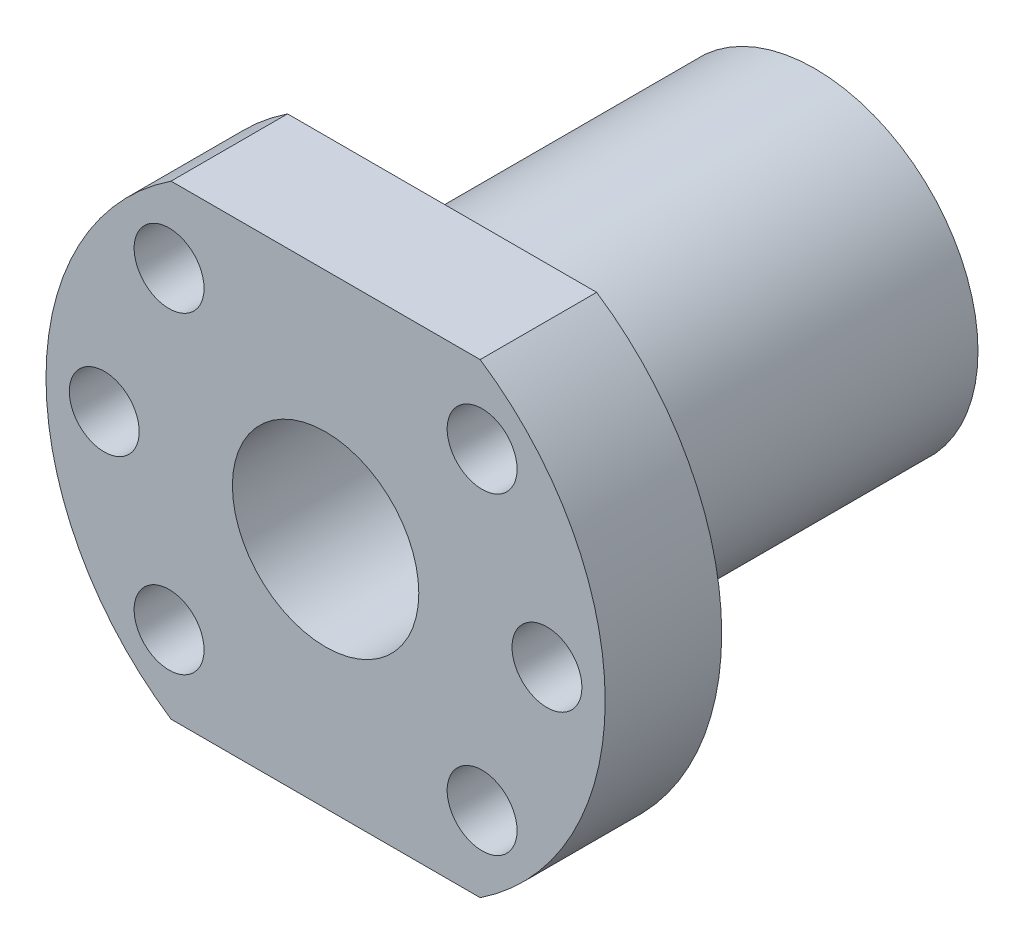
ISO-10303-21;
HEADER;
FILE_DESCRIPTION(('STEP AP214'),'2;1');
FILE_NAME('part.step','',(''),(''),'','','');
FILE_SCHEMA(('AUTOMOTIVE_DESIGN { 1 0 10303 214 1 1 1 1 }'));
ENDSEC;
DATA;
#1=APPLICATION_CONTEXT('core data for automotive mechanical design processes');
#2=APPLICATION_PROTOCOL_DEFINITION('international standard','automotive_design',2000,#1);
#3=PRODUCT_CONTEXT('',#1,'mechanical');
#4=PRODUCT('Part','Part','',(#3));
#5=PRODUCT_RELATED_PRODUCT_CATEGORY('part','',(#4));
#6=PRODUCT_DEFINITION_FORMATION('','',#4);
#7=PRODUCT_DEFINITION_CONTEXT('part definition',#1,'design');
#8=PRODUCT_DEFINITION('design','',#6,#7);
#9=PRODUCT_DEFINITION_SHAPE('','',#8);
#10=(LENGTH_UNIT() NAMED_UNIT(*) SI_UNIT(.MILLI.,.METRE.));
#11=(NAMED_UNIT(*) PLANE_ANGLE_UNIT() SI_UNIT($,.RADIAN.));
#12=(NAMED_UNIT(*) SI_UNIT($,.STERADIAN.) SOLID_ANGLE_UNIT());
#13=UNCERTAINTY_MEASURE_WITH_UNIT(LENGTH_MEASURE(1.E-05),#10,'distance_accuracy_value','');
#14=(GEOMETRIC_REPRESENTATION_CONTEXT(3) GLOBAL_UNCERTAINTY_ASSIGNED_CONTEXT((#13)) GLOBAL_UNIT_ASSIGNED_CONTEXT((#10,
#11,#12)) REPRESENTATION_CONTEXT('',''));
#15=CARTESIAN_POINT('',(0.,0.,0.));
#16=DIRECTION('',(0.,0.,1.));
#17=DIRECTION('',(1.,0.,0.));
#18=AXIS2_PLACEMENT_3D('',#15,#16,#17);
#19=CARTESIAN_POINT('',(0.,20.,10.));
#20=DIRECTION('',(0.,1.,0.));
#21=DIRECTION('',(0.,0.,1.));
#22=AXIS2_PLACEMENT_3D('',#19,#20,#21);
#23=PLANE('',#22);
#24=DIRECTION('',(1.,0.,0.));
#25=VECTOR('',#24,1.);
#26=CARTESIAN_POINT('',(0.,20.,0.));
#27=LINE('',#26,#25);
#28=CARTESIAN_POINT('',(-13.2664991614216,20.,0.));
#29=VERTEX_POINT('',#28);
#30=CARTESIAN_POINT('',(13.2664991614216,20.,0.));
#31=VERTEX_POINT('',#30);
#32=EDGE_CURVE('E108',#29,#31,#27,.T.);
#33=ORIENTED_EDGE('',*,*,#32,.F.);
#34=DIRECTION('',(0.,0.,-1.));
#35=VECTOR('',#34,1.);
#36=CARTESIAN_POINT('',(-13.2664991614216,20.,10.));
#37=LINE('',#36,#35);
#38=CARTESIAN_POINT('',(-13.2664991614216,20.,10.));
#39=VERTEX_POINT('',#38);
#40=EDGE_CURVE('E11',#39,#29,#37,.T.);
#41=ORIENTED_EDGE('',*,*,#40,.F.);
#42=DIRECTION('',(1.,0.,0.));
#43=VECTOR('',#42,1.);
#44=CARTESIAN_POINT('',(0.,20.,10.));
#45=LINE('',#44,#43);
#46=CARTESIAN_POINT('',(13.2664991614216,20.,10.));
#47=VERTEX_POINT('',#46);
#48=EDGE_CURVE('E93',#39,#47,#45,.T.);
#49=ORIENTED_EDGE('',*,*,#48,.T.);
#50=DIRECTION('',(0.,0.,-1.));
#51=VECTOR('',#50,1.);
#52=CARTESIAN_POINT('',(13.2664991614216,20.,10.));
#53=LINE('',#52,#51);
#54=EDGE_CURVE('E74',#47,#31,#53,.T.);
#55=ORIENTED_EDGE('',*,*,#54,.T.);
#56=EDGE_LOOP('',(#33,#41,#49,#55));
#57=FACE_BOUND('',#56,.T.);
#58=ADVANCED_FACE('F35',(#57),#23,.T.);
#59=CARTESIAN_POINT('',(0.,0.,10.));
#60=DIRECTION('',(0.,0.,-1.));
#61=DIRECTION('',(-1.,0.,0.));
#62=AXIS2_PLACEMENT_3D('',#59,#60,#61);
#63=CYLINDRICAL_SURFACE('',#62,24.);
#64=CARTESIAN_POINT('',(0.,0.,0.));
#65=DIRECTION('',(0.,0.,1.));
#66=DIRECTION('',(1.,0.,0.));
#67=AXIS2_PLACEMENT_3D('',#64,#65,#66);
#68=CIRCLE('',#67,24.);
#69=CARTESIAN_POINT('',(-13.2664991614216,-20.,0.));
#70=VERTEX_POINT('',#69);
#71=EDGE_CURVE('E98',#29,#70,#68,.T.);
#72=ORIENTED_EDGE('',*,*,#71,.T.);
#73=DIRECTION('',(0.,0.,-1.));
#74=VECTOR('',#73,1.);
#75=CARTESIAN_POINT('',(-13.2664991614216,-20.,10.));
#76=LINE('',#75,#74);
#77=CARTESIAN_POINT('',(-13.2664991614216,-20.,10.));
#78=VERTEX_POINT('',#77);
#79=EDGE_CURVE('E44',#78,#70,#76,.T.);
#80=ORIENTED_EDGE('',*,*,#79,.F.);
#81=CARTESIAN_POINT('',(0.,0.,10.));
#82=DIRECTION('',(0.,0.,1.));
#83=DIRECTION('',(1.,0.,0.));
#84=AXIS2_PLACEMENT_3D('',#81,#82,#83);
#85=CIRCLE('',#84,24.);
#86=EDGE_CURVE('E89',#39,#78,#85,.T.);
#87=ORIENTED_EDGE('',*,*,#86,.F.);
#88=ORIENTED_EDGE('',*,*,#40,.T.);
#89=EDGE_LOOP('',(#72,#80,#87,#88));
#90=FACE_BOUND('',#89,.T.);
#91=ADVANCED_FACE('F96',(#90),#63,.T.);
#92=CARTESIAN_POINT('',(0.,-20.,10.));
#93=DIRECTION('',(0.,1.,0.));
#94=DIRECTION('',(0.,0.,1.));
#95=AXIS2_PLACEMENT_3D('',#92,#93,#94);
#96=PLANE('',#95);
#97=DIRECTION('',(1.,0.,0.));
#98=VECTOR('',#97,1.);
#99=CARTESIAN_POINT('',(0.,-20.,0.));
#100=LINE('',#99,#98);
#101=CARTESIAN_POINT('',(13.2664991614216,-20.,0.));
#102=VERTEX_POINT('',#101);
#103=EDGE_CURVE('E105',#70,#102,#100,.T.);
#104=ORIENTED_EDGE('',*,*,#103,.T.);
#105=DIRECTION('',(0.,0.,-1.));
#106=VECTOR('',#105,1.);
#107=CARTESIAN_POINT('',(13.2664991614216,-20.,10.));
#108=LINE('',#107,#106);
#109=CARTESIAN_POINT('',(13.2664991614216,-20.,10.));
#110=VERTEX_POINT('',#109);
#111=EDGE_CURVE('E88',#110,#102,#108,.T.);
#112=ORIENTED_EDGE('',*,*,#111,.F.);
#113=DIRECTION('',(1.,0.,0.));
#114=VECTOR('',#113,1.);
#115=CARTESIAN_POINT('',(0.,-20.,10.));
#116=LINE('',#115,#114);
#117=EDGE_CURVE('E82',#78,#110,#116,.T.);
#118=ORIENTED_EDGE('',*,*,#117,.F.);
#119=ORIENTED_EDGE('',*,*,#79,.T.);
#120=EDGE_LOOP('',(#104,#112,#118,#119));
#121=FACE_BOUND('',#120,.T.);
#122=ADVANCED_FACE('F85',(#121),#96,.F.);
#123=CARTESIAN_POINT('',(0.,0.,10.));
#124=DIRECTION('',(0.,0.,-1.));
#125=DIRECTION('',(-1.,0.,0.));
#126=AXIS2_PLACEMENT_3D('',#123,#124,#125);
#127=CYLINDRICAL_SURFACE('',#126,24.);
#128=CARTESIAN_POINT('',(0.,0.,0.));
#129=DIRECTION('',(0.,0.,1.));
#130=DIRECTION('',(1.,0.,0.));
#131=AXIS2_PLACEMENT_3D('',#128,#129,#130);
#132=CIRCLE('',#131,24.);
#133=EDGE_CURVE('E67',#102,#31,#132,.T.);
#134=ORIENTED_EDGE('',*,*,#133,.T.);
#135=ORIENTED_EDGE('',*,*,#54,.F.);
#136=CARTESIAN_POINT('',(0.,0.,10.));
#137=DIRECTION('',(0.,0.,1.));
#138=DIRECTION('',(1.,0.,0.));
#139=AXIS2_PLACEMENT_3D('',#136,#137,#138);
#140=CIRCLE('',#139,24.);
#141=EDGE_CURVE('E52',#110,#47,#140,.T.);
#142=ORIENTED_EDGE('',*,*,#141,.F.);
#143=ORIENTED_EDGE('',*,*,#111,.T.);
#144=EDGE_LOOP('',(#134,#135,#142,#143));
#145=FACE_BOUND('',#144,.T.);
#146=ADVANCED_FACE('F189',(#145),#127,.T.);
#147=CARTESIAN_POINT('',(19.,0.,10.));
#148=DIRECTION('',(0.,0.,-1.));
#149=DIRECTION('',(-1.,0.,0.));
#150=AXIS2_PLACEMENT_3D('',#147,#148,#149);
#151=CYLINDRICAL_SURFACE('',#150,3.);
#152=CARTESIAN_POINT('',(19.,0.,10.));
#153=DIRECTION('',(0.,0.,1.));
#154=DIRECTION('',(1.,0.,0.));
#155=AXIS2_PLACEMENT_3D('',#152,#153,#154);
#156=CIRCLE('',#155,3.);
#157=CARTESIAN_POINT('',(22.,0.,10.));
#158=VERTEX_POINT('',#157);
#159=EDGE_CURVE('E133',#158,#158,#156,.T.);
#160=ORIENTED_EDGE('',*,*,#159,.T.);
#161=EDGE_LOOP('',(#160));
#162=FACE_BOUND('',#161,.T.);
#163=CARTESIAN_POINT('',(19.,0.,0.));
#164=DIRECTION('',(0.,0.,1.));
#165=DIRECTION('',(1.,0.,0.));
#166=AXIS2_PLACEMENT_3D('',#163,#164,#165);
#167=CIRCLE('',#166,3.);
#168=CARTESIAN_POINT('',(22.,0.,0.));
#169=VERTEX_POINT('',#168);
#170=EDGE_CURVE('E110',#169,#169,#167,.T.);
#171=ORIENTED_EDGE('',*,*,#170,.F.);
#172=EDGE_LOOP('',(#171));
#173=FACE_BOUND('',#172,.T.);
#174=ADVANCED_FACE('F185',(#162,#173),#151,.F.);
#175=CARTESIAN_POINT('',(13.4350288425444,-13.4350288425444,10.));
#176=DIRECTION('',(0.,0.,-1.));
#177=DIRECTION('',(-1.,0.,0.));
#178=AXIS2_PLACEMENT_3D('',#175,#176,#177);
#179=CYLINDRICAL_SURFACE('',#178,3.);
#180=CARTESIAN_POINT('',(13.4350288425444,-13.4350288425444,10.));
#181=DIRECTION('',(0.,0.,1.));
#182=DIRECTION('',(1.,0.,0.));
#183=AXIS2_PLACEMENT_3D('',#180,#181,#182);
#184=CIRCLE('',#183,3.);
#185=CARTESIAN_POINT('',(16.4350288425444,-13.4350288425444,10.));
#186=VERTEX_POINT('',#185);
#187=EDGE_CURVE('E136',#186,#186,#184,.T.);
#188=ORIENTED_EDGE('',*,*,#187,.T.);
#189=EDGE_LOOP('',(#188));
#190=FACE_BOUND('',#189,.T.);
#191=CARTESIAN_POINT('',(13.4350288425444,-13.4350288425444,0.));
#192=DIRECTION('',(0.,0.,1.));
#193=DIRECTION('',(1.,0.,0.));
#194=AXIS2_PLACEMENT_3D('',#191,#192,#193);
#195=CIRCLE('',#194,3.);
#196=CARTESIAN_POINT('',(16.4350288425444,-13.4350288425444,0.));
#197=VERTEX_POINT('',#196);
#198=EDGE_CURVE('E113',#197,#197,#195,.T.);
#199=ORIENTED_EDGE('',*,*,#198,.F.);
#200=EDGE_LOOP('',(#199));
#201=FACE_BOUND('',#200,.T.);
#202=ADVANCED_FACE('F188',(#190,#201),#179,.F.);
#203=CARTESIAN_POINT('',(-13.4350288425444,-13.4350288425444,10.));
#204=DIRECTION('',(0.,0.,-1.));
#205=DIRECTION('',(-1.,0.,0.));
#206=AXIS2_PLACEMENT_3D('',#203,#204,#205);
#207=CYLINDRICAL_SURFACE('',#206,3.);
#208=CARTESIAN_POINT('',(-13.4350288425444,-13.4350288425444,10.));
#209=DIRECTION('',(0.,0.,1.));
#210=DIRECTION('',(1.,0.,0.));
#211=AXIS2_PLACEMENT_3D('',#208,#209,#210);
#212=CIRCLE('',#211,3.);
#213=CARTESIAN_POINT('',(-10.4350288425444,-13.4350288425444,10.));
#214=VERTEX_POINT('',#213);
#215=EDGE_CURVE('E139',#214,#214,#212,.T.);
#216=ORIENTED_EDGE('',*,*,#215,.T.);
#217=EDGE_LOOP('',(#216));
#218=FACE_BOUND('',#217,.T.);
#219=CARTESIAN_POINT('',(-13.4350288425444,-13.4350288425444,0.));
#220=DIRECTION('',(0.,0.,1.));
#221=DIRECTION('',(1.,0.,0.));
#222=AXIS2_PLACEMENT_3D('',#219,#220,#221);
#223=CIRCLE('',#222,3.);
#224=CARTESIAN_POINT('',(-10.4350288425444,-13.4350288425444,0.));
#225=VERTEX_POINT('',#224);
#226=EDGE_CURVE('E116',#225,#225,#223,.T.);
#227=ORIENTED_EDGE('',*,*,#226,.F.);
#228=EDGE_LOOP('',(#227));
#229=FACE_BOUND('',#228,.T.);
#230=ADVANCED_FACE('F193',(#218,#229),#207,.F.);
#231=CARTESIAN_POINT('',(-19.,0.,10.));
#232=DIRECTION('',(0.,0.,-1.));
#233=DIRECTION('',(-1.,0.,0.));
#234=AXIS2_PLACEMENT_3D('',#231,#232,#233);
#235=CYLINDRICAL_SURFACE('',#234,3.);
#236=CARTESIAN_POINT('',(-19.,0.,10.));
#237=DIRECTION('',(0.,0.,1.));
#238=DIRECTION('',(1.,0.,0.));
#239=AXIS2_PLACEMENT_3D('',#236,#237,#238);
#240=CIRCLE('',#239,3.);
#241=CARTESIAN_POINT('',(-16.,0.,10.));
#242=VERTEX_POINT('',#241);
#243=EDGE_CURVE('E142',#242,#242,#240,.T.);
#244=ORIENTED_EDGE('',*,*,#243,.T.);
#245=EDGE_LOOP('',(#244));
#246=FACE_BOUND('',#245,.T.);
#247=CARTESIAN_POINT('',(-19.,0.,0.));
#248=DIRECTION('',(0.,0.,1.));
#249=DIRECTION('',(1.,0.,0.));
#250=AXIS2_PLACEMENT_3D('',#247,#248,#249);
#251=CIRCLE('',#250,3.);
#252=CARTESIAN_POINT('',(-16.,0.,0.));
#253=VERTEX_POINT('',#252);
#254=EDGE_CURVE('E119',#253,#253,#251,.T.);
#255=ORIENTED_EDGE('',*,*,#254,.F.);
#256=EDGE_LOOP('',(#255));
#257=FACE_BOUND('',#256,.T.);
#258=ADVANCED_FACE('F197',(#246,#257),#235,.F.);
#259=CARTESIAN_POINT('',(-13.4350288425444,13.4350288425444,10.));
#260=DIRECTION('',(0.,0.,-1.));
#261=DIRECTION('',(-1.,0.,0.));
#262=AXIS2_PLACEMENT_3D('',#259,#260,#261);
#263=CYLINDRICAL_SURFACE('',#262,3.);
#264=CARTESIAN_POINT('',(-13.4350288425444,13.4350288425444,10.));
#265=DIRECTION('',(0.,0.,1.));
#266=DIRECTION('',(1.,0.,0.));
#267=AXIS2_PLACEMENT_3D('',#264,#265,#266);
#268=CIRCLE('',#267,3.);
#269=CARTESIAN_POINT('',(-10.4350288425444,13.4350288425444,10.));
#270=VERTEX_POINT('',#269);
#271=EDGE_CURVE('E145',#270,#270,#268,.T.);
#272=ORIENTED_EDGE('',*,*,#271,.T.);
#273=EDGE_LOOP('',(#272));
#274=FACE_BOUND('',#273,.T.);
#275=CARTESIAN_POINT('',(-13.4350288425444,13.4350288425444,0.));
#276=DIRECTION('',(0.,0.,1.));
#277=DIRECTION('',(1.,0.,0.));
#278=AXIS2_PLACEMENT_3D('',#275,#276,#277);
#279=CIRCLE('',#278,3.);
#280=CARTESIAN_POINT('',(-10.4350288425444,13.4350288425444,0.));
#281=VERTEX_POINT('',#280);
#282=EDGE_CURVE('E122',#281,#281,#279,.T.);
#283=ORIENTED_EDGE('',*,*,#282,.F.);
#284=EDGE_LOOP('',(#283));
#285=FACE_BOUND('',#284,.T.);
#286=ADVANCED_FACE('F173',(#274,#285),#263,.F.);
#287=CARTESIAN_POINT('',(13.4350288425444,13.4350288425444,10.));
#288=DIRECTION('',(0.,0.,-1.));
#289=DIRECTION('',(-1.,0.,0.));
#290=AXIS2_PLACEMENT_3D('',#287,#288,#289);
#291=CYLINDRICAL_SURFACE('',#290,3.);
#292=CARTESIAN_POINT('',(13.4350288425444,13.4350288425444,10.));
#293=DIRECTION('',(0.,0.,1.));
#294=DIRECTION('',(1.,0.,0.));
#295=AXIS2_PLACEMENT_3D('',#292,#293,#294);
#296=CIRCLE('',#295,3.);
#297=CARTESIAN_POINT('',(16.4350288425444,13.4350288425444,10.));
#298=VERTEX_POINT('',#297);
#299=EDGE_CURVE('E104',#298,#298,#296,.T.);
#300=ORIENTED_EDGE('',*,*,#299,.T.);
#301=EDGE_LOOP('',(#300));
#302=FACE_BOUND('',#301,.T.);
#303=CARTESIAN_POINT('',(13.4350288425444,13.4350288425444,0.));
#304=DIRECTION('',(0.,0.,1.));
#305=DIRECTION('',(1.,0.,0.));
#306=AXIS2_PLACEMENT_3D('',#303,#304,#305);
#307=CIRCLE('',#306,3.);
#308=CARTESIAN_POINT('',(16.4350288425444,13.4350288425444,0.));
#309=VERTEX_POINT('',#308);
#310=EDGE_CURVE('E125',#309,#309,#307,.T.);
#311=ORIENTED_EDGE('',*,*,#310,.F.);
#312=EDGE_LOOP('',(#311));
#313=FACE_BOUND('',#312,.T.);
#314=ADVANCED_FACE('F37',(#302,#313),#291,.F.);
#315=CARTESIAN_POINT('',(0.,0.,10.));
#316=DIRECTION('',(0.,0.,-1.));
#317=DIRECTION('',(-1.,0.,0.));
#318=AXIS2_PLACEMENT_3D('',#315,#316,#317);
#319=CYLINDRICAL_SURFACE('',#318,8.);
#320=CARTESIAN_POINT('',(0.,0.,10.));
#321=DIRECTION('',(0.,0.,1.));
#322=DIRECTION('',(1.,0.,0.));
#323=AXIS2_PLACEMENT_3D('',#320,#321,#322);
#324=CIRCLE('',#323,8.);
#325=CARTESIAN_POINT('',(8.,0.,10.));
#326=VERTEX_POINT('',#325);
#327=EDGE_CURVE('E102',#326,#326,#324,.T.);
#328=ORIENTED_EDGE('',*,*,#327,.T.);
#329=EDGE_LOOP('',(#328));
#330=FACE_BOUND('',#329,.T.);
#331=CARTESIAN_POINT('',(0.,0.,-32.));
#332=DIRECTION('',(0.,0.,1.));
#333=DIRECTION('',(1.,0.,0.));
#334=AXIS2_PLACEMENT_3D('',#331,#332,#333);
#335=CIRCLE('',#334,8.);
#336=CARTESIAN_POINT('',(8.,0.,-32.));
#337=VERTEX_POINT('',#336);
#338=EDGE_CURVE('E153',#337,#337,#335,.T.);
#339=ORIENTED_EDGE('',*,*,#338,.F.);
#340=EDGE_LOOP('',(#339));
#341=FACE_BOUND('',#340,.T.);
#342=ADVANCED_FACE('F162',(#330,#341),#319,.F.);
#343=CARTESIAN_POINT('',(0.,0.,10.));
#344=DIRECTION('',(0.,0.,1.));
#345=DIRECTION('',(1.,0.,0.));
#346=AXIS2_PLACEMENT_3D('',#343,#344,#345);
#347=PLANE('',#346);
#348=ORIENTED_EDGE('',*,*,#299,.F.);
#349=EDGE_LOOP('',(#348));
#350=FACE_BOUND('',#349,.T.);
#351=ORIENTED_EDGE('',*,*,#271,.F.);
#352=EDGE_LOOP('',(#351));
#353=FACE_BOUND('',#352,.T.);
#354=ORIENTED_EDGE('',*,*,#243,.F.);
#355=EDGE_LOOP('',(#354));
#356=FACE_BOUND('',#355,.T.);
#357=ORIENTED_EDGE('',*,*,#215,.F.);
#358=EDGE_LOOP('',(#357));
#359=FACE_BOUND('',#358,.T.);
#360=ORIENTED_EDGE('',*,*,#187,.F.);
#361=EDGE_LOOP('',(#360));
#362=FACE_BOUND('',#361,.T.);
#363=ORIENTED_EDGE('',*,*,#159,.F.);
#364=EDGE_LOOP('',(#363));
#365=FACE_BOUND('',#364,.T.);
#366=ORIENTED_EDGE('',*,*,#48,.F.);
#367=ORIENTED_EDGE('',*,*,#86,.T.);
#368=ORIENTED_EDGE('',*,*,#117,.T.);
#369=ORIENTED_EDGE('',*,*,#141,.T.);
#370=EDGE_LOOP('',(#366,#367,#368,#369));
#371=FACE_BOUND('',#370,.T.);
#372=ORIENTED_EDGE('',*,*,#327,.F.);
#373=EDGE_LOOP('',(#372));
#374=FACE_BOUND('',#373,.T.);
#375=ADVANCED_FACE('F91',(#350,#353,#356,#359,#362,#365,#371,#374),#347,.T.);
#376=CARTESIAN_POINT('',(0.,0.,0.));
#377=DIRECTION('',(0.,0.,1.));
#378=DIRECTION('',(1.,0.,0.));
#379=AXIS2_PLACEMENT_3D('',#376,#377,#378);
#380=PLANE('',#379);
#381=CARTESIAN_POINT('',(0.,0.,0.));
#382=DIRECTION('',(0.,0.,1.));
#383=DIRECTION('',(1.,0.,0.));
#384=AXIS2_PLACEMENT_3D('',#381,#382,#383);
#385=CIRCLE('',#384,14.);
#386=CARTESIAN_POINT('',(14.,0.,0.));
#387=VERTEX_POINT('',#386);
#388=EDGE_CURVE('E150',#387,#387,#385,.T.);
#389=ORIENTED_EDGE('',*,*,#388,.T.);
#390=EDGE_LOOP('',(#389));
#391=FACE_BOUND('',#390,.T.);
#392=ORIENTED_EDGE('',*,*,#310,.T.);
#393=EDGE_LOOP('',(#392));
#394=FACE_BOUND('',#393,.T.);
#395=ORIENTED_EDGE('',*,*,#282,.T.);
#396=EDGE_LOOP('',(#395));
#397=FACE_BOUND('',#396,.T.);
#398=ORIENTED_EDGE('',*,*,#254,.T.);
#399=EDGE_LOOP('',(#398));
#400=FACE_BOUND('',#399,.T.);
#401=ORIENTED_EDGE('',*,*,#226,.T.);
#402=EDGE_LOOP('',(#401));
#403=FACE_BOUND('',#402,.T.);
#404=ORIENTED_EDGE('',*,*,#198,.T.);
#405=EDGE_LOOP('',(#404));
#406=FACE_BOUND('',#405,.T.);
#407=ORIENTED_EDGE('',*,*,#170,.T.);
#408=EDGE_LOOP('',(#407));
#409=FACE_BOUND('',#408,.T.);
#410=ORIENTED_EDGE('',*,*,#32,.T.);
#411=ORIENTED_EDGE('',*,*,#133,.F.);
#412=ORIENTED_EDGE('',*,*,#103,.F.);
#413=ORIENTED_EDGE('',*,*,#71,.F.);
#414=EDGE_LOOP('',(#410,#411,#412,#413));
#415=FACE_BOUND('',#414,.T.);
#416=ADVANCED_FACE('F170',(#391,#394,#397,#400,#403,#406,#409,#415),#380,.F.);
#417=CARTESIAN_POINT('',(0.,0.,-32.));
#418=DIRECTION('',(0.,0.,1.));
#419=DIRECTION('',(1.,0.,0.));
#420=AXIS2_PLACEMENT_3D('',#417,#418,#419);
#421=CYLINDRICAL_SURFACE('',#420,14.);
#422=CARTESIAN_POINT('',(0.,0.,-32.));
#423=DIRECTION('',(0.,0.,1.));
#424=DIRECTION('',(1.,0.,0.));
#425=AXIS2_PLACEMENT_3D('',#422,#423,#424);
#426=CIRCLE('',#425,14.);
#427=CARTESIAN_POINT('',(14.,0.,-32.));
#428=VERTEX_POINT('',#427);
#429=EDGE_CURVE('E128',#428,#428,#426,.T.);
#430=ORIENTED_EDGE('',*,*,#429,.T.);
#431=EDGE_LOOP('',(#430));
#432=FACE_BOUND('',#431,.T.);
#433=ORIENTED_EDGE('',*,*,#388,.F.);
#434=EDGE_LOOP('',(#433));
#435=FACE_BOUND('',#434,.T.);
#436=ADVANCED_FACE('F211',(#432,#435),#421,.T.);
#437=CARTESIAN_POINT('',(0.,0.,-32.));
#438=DIRECTION('',(0.,0.,1.));
#439=DIRECTION('',(1.,0.,0.));
#440=AXIS2_PLACEMENT_3D('',#437,#438,#439);
#441=PLANE('',#440);
#442=ORIENTED_EDGE('',*,*,#338,.T.);
#443=EDGE_LOOP('',(#442));
#444=FACE_BOUND('',#443,.T.);
#445=ORIENTED_EDGE('',*,*,#429,.F.);
#446=EDGE_LOOP('',(#445));
#447=FACE_BOUND('',#446,.T.);
#448=ADVANCED_FACE('F159',(#444,#447),#441,.F.);
#449=CLOSED_SHELL('',(#58,#91,#122,#146,#174,#202,#230,#258,#286,#314,#342,#375,#416,#436,#448));
#450=MANIFOLD_SOLID_BREP('B2',#449);
#451=ADVANCED_BREP_SHAPE_REPRESENTATION('',(#18,#450),#14);
#452=SHAPE_DEFINITION_REPRESENTATION(#9,#451);
ENDSEC;
END-ISO-10303-21;
